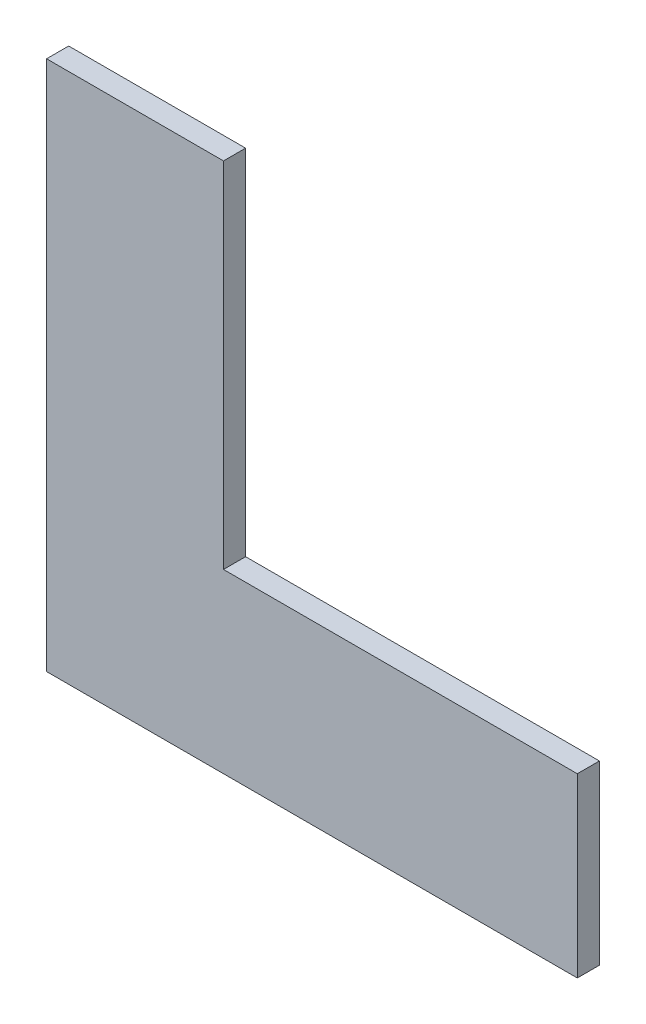
ISO-10303-21;
HEADER;
FILE_DESCRIPTION(('STEP AP214'),'2;1');
FILE_NAME('part.step','',(''),(''),'','','');
FILE_SCHEMA(('AUTOMOTIVE_DESIGN { 1 0 10303 214 1 1 1 1 }'));
ENDSEC;
DATA;
#1=APPLICATION_CONTEXT('core data for automotive mechanical design processes');
#2=APPLICATION_PROTOCOL_DEFINITION('international standard','automotive_design',2000,#1);
#3=PRODUCT_CONTEXT('',#1,'mechanical');
#4=PRODUCT('Part','Part','',(#3));
#5=PRODUCT_RELATED_PRODUCT_CATEGORY('part','',(#4));
#6=PRODUCT_DEFINITION_FORMATION('','',#4);
#7=PRODUCT_DEFINITION_CONTEXT('part definition',#1,'design');
#8=PRODUCT_DEFINITION('design','',#6,#7);
#9=PRODUCT_DEFINITION_SHAPE('','',#8);
#10=(LENGTH_UNIT() NAMED_UNIT(*) SI_UNIT(.MILLI.,.METRE.));
#11=(NAMED_UNIT(*) PLANE_ANGLE_UNIT() SI_UNIT($,.RADIAN.));
#12=(NAMED_UNIT(*) SI_UNIT($,.STERADIAN.) SOLID_ANGLE_UNIT());
#13=UNCERTAINTY_MEASURE_WITH_UNIT(LENGTH_MEASURE(1.E-05),#10,'distance_accuracy_value','');
#14=(GEOMETRIC_REPRESENTATION_CONTEXT(3) GLOBAL_UNCERTAINTY_ASSIGNED_CONTEXT((#13)) GLOBAL_UNIT_ASSIGNED_CONTEXT((#10,
#11,#12)) REPRESENTATION_CONTEXT('',''));
#15=CARTESIAN_POINT('',(0.,0.,0.));
#16=DIRECTION('',(0.,0.,1.));
#17=DIRECTION('',(1.,0.,0.));
#18=AXIS2_PLACEMENT_3D('',#15,#16,#17);
#19=CARTESIAN_POINT('',(-38.1,-38.1,3.175));
#20=DIRECTION('',(1.,0.,0.));
#21=DIRECTION('',(0.,1.,0.));
#22=AXIS2_PLACEMENT_3D('',#19,#20,#21);
#23=PLANE('',#22);
#24=DIRECTION('',(0.,-1.,0.));
#25=VECTOR('',#24,1.);
#26=CARTESIAN_POINT('',(-38.1,-38.1,0.));
#27=LINE('',#26,#25);
#28=CARTESIAN_POINT('',(-38.1,38.1,0.));
#29=VERTEX_POINT('',#28);
#30=CARTESIAN_POINT('',(-38.1,-38.1,0.));
#31=VERTEX_POINT('',#30);
#32=EDGE_CURVE('E121',#29,#31,#27,.T.);
#33=ORIENTED_EDGE('',*,*,#32,.T.);
#34=DIRECTION('',(0.,0.,-1.));
#35=VECTOR('',#34,1.);
#36=CARTESIAN_POINT('',(-38.1,-38.1,3.175));
#37=LINE('',#36,#35);
#38=CARTESIAN_POINT('',(-38.1,-38.1,3.175));
#39=VERTEX_POINT('',#38);
#40=EDGE_CURVE('E11',#39,#31,#37,.T.);
#41=ORIENTED_EDGE('',*,*,#40,.F.);
#42=DIRECTION('',(0.,-1.,0.));
#43=VECTOR('',#42,1.);
#44=CARTESIAN_POINT('',(-38.1,-38.1,3.175));
#45=LINE('',#44,#43);
#46=CARTESIAN_POINT('',(-38.1,38.1,3.175));
#47=VERTEX_POINT('',#46);
#48=EDGE_CURVE('E131',#47,#39,#45,.T.);
#49=ORIENTED_EDGE('',*,*,#48,.F.);
#50=DIRECTION('',(0.,0.,-1.));
#51=VECTOR('',#50,1.);
#52=CARTESIAN_POINT('',(-38.1,38.1,3.175));
#53=LINE('',#52,#51);
#54=EDGE_CURVE('E117',#47,#29,#53,.T.);
#55=ORIENTED_EDGE('',*,*,#54,.T.);
#56=EDGE_LOOP('',(#33,#41,#49,#55));
#57=FACE_BOUND('',#56,.T.);
#58=ADVANCED_FACE('F37',(#57),#23,.F.);
#59=CARTESIAN_POINT('',(38.1,-38.1,3.175));
#60=DIRECTION('',(0.,1.,0.));
#61=DIRECTION('',(-1.,0.,0.));
#62=AXIS2_PLACEMENT_3D('',#59,#60,#61);
#63=PLANE('',#62);
#64=DIRECTION('',(1.,0.,0.));
#65=VECTOR('',#64,1.);
#66=CARTESIAN_POINT('',(38.1,-38.1,0.));
#67=LINE('',#66,#65);
#68=CARTESIAN_POINT('',(38.1,-38.1,0.));
#69=VERTEX_POINT('',#68);
#70=EDGE_CURVE('E124',#31,#69,#67,.T.);
#71=ORIENTED_EDGE('',*,*,#70,.T.);
#72=DIRECTION('',(0.,0.,-1.));
#73=VECTOR('',#72,1.);
#74=CARTESIAN_POINT('',(38.1,-38.1,3.175));
#75=LINE('',#74,#73);
#76=CARTESIAN_POINT('',(38.1,-38.1,3.175));
#77=VERTEX_POINT('',#76);
#78=EDGE_CURVE('E45',#77,#69,#75,.T.);
#79=ORIENTED_EDGE('',*,*,#78,.F.);
#80=DIRECTION('',(1.,0.,0.));
#81=VECTOR('',#80,1.);
#82=CARTESIAN_POINT('',(38.1,-38.1,3.175));
#83=LINE('',#82,#81);
#84=EDGE_CURVE('E90',#39,#77,#83,.T.);
#85=ORIENTED_EDGE('',*,*,#84,.F.);
#86=ORIENTED_EDGE('',*,*,#40,.T.);
#87=EDGE_LOOP('',(#71,#79,#85,#86));
#88=FACE_BOUND('',#87,.T.);
#89=ADVANCED_FACE('F155',(#88),#63,.F.);
#90=CARTESIAN_POINT('',(38.1,-12.7,3.175));
#91=DIRECTION('',(-1.,0.,0.));
#92=DIRECTION('',(0.,-1.,0.));
#93=AXIS2_PLACEMENT_3D('',#90,#91,#92);
#94=PLANE('',#93);
#95=DIRECTION('',(0.,1.,0.));
#96=VECTOR('',#95,1.);
#97=CARTESIAN_POINT('',(38.1,-12.7,0.));
#98=LINE('',#97,#96);
#99=CARTESIAN_POINT('',(38.1,-12.7,0.));
#100=VERTEX_POINT('',#99);
#101=EDGE_CURVE('E126',#69,#100,#98,.T.);
#102=ORIENTED_EDGE('',*,*,#101,.T.);
#103=DIRECTION('',(0.,0.,-1.));
#104=VECTOR('',#103,1.);
#105=CARTESIAN_POINT('',(38.1,-12.7,3.175));
#106=LINE('',#105,#104);
#107=CARTESIAN_POINT('',(38.1,-12.7,3.175));
#108=VERTEX_POINT('',#107);
#109=EDGE_CURVE('E112',#108,#100,#106,.T.);
#110=ORIENTED_EDGE('',*,*,#109,.F.);
#111=DIRECTION('',(0.,1.,0.));
#112=VECTOR('',#111,1.);
#113=CARTESIAN_POINT('',(38.1,-12.7,3.175));
#114=LINE('',#113,#112);
#115=EDGE_CURVE('E103',#77,#108,#114,.T.);
#116=ORIENTED_EDGE('',*,*,#115,.F.);
#117=ORIENTED_EDGE('',*,*,#78,.T.);
#118=EDGE_LOOP('',(#102,#110,#116,#117));
#119=FACE_BOUND('',#118,.T.);
#120=ADVANCED_FACE('F137',(#119),#94,.F.);
#121=CARTESIAN_POINT('',(-12.7,-12.7,3.175));
#122=DIRECTION('',(0.,-1.,0.));
#123=DIRECTION('',(1.,0.,0.));
#124=AXIS2_PLACEMENT_3D('',#121,#122,#123);
#125=PLANE('',#124);
#126=DIRECTION('',(-1.,0.,0.));
#127=VECTOR('',#126,1.);
#128=CARTESIAN_POINT('',(-12.7,-12.7,0.));
#129=LINE('',#128,#127);
#130=CARTESIAN_POINT('',(-12.7,-12.7,0.));
#131=VERTEX_POINT('',#130);
#132=EDGE_CURVE('E111',#100,#131,#129,.T.);
#133=ORIENTED_EDGE('',*,*,#132,.T.);
#134=DIRECTION('',(0.,0.,-1.));
#135=VECTOR('',#134,1.);
#136=CARTESIAN_POINT('',(-12.7,-12.7,3.175));
#137=LINE('',#136,#135);
#138=CARTESIAN_POINT('',(-12.7,-12.7,3.175));
#139=VERTEX_POINT('',#138);
#140=EDGE_CURVE('E108',#139,#131,#137,.T.);
#141=ORIENTED_EDGE('',*,*,#140,.F.);
#142=DIRECTION('',(-1.,0.,0.));
#143=VECTOR('',#142,1.);
#144=CARTESIAN_POINT('',(-12.7,-12.7,3.175));
#145=LINE('',#144,#143);
#146=EDGE_CURVE('E97',#108,#139,#145,.T.);
#147=ORIENTED_EDGE('',*,*,#146,.F.);
#148=ORIENTED_EDGE('',*,*,#109,.T.);
#149=EDGE_LOOP('',(#133,#141,#147,#148));
#150=FACE_BOUND('',#149,.T.);
#151=ADVANCED_FACE('F109',(#150),#125,.F.);
#152=CARTESIAN_POINT('',(-12.7,38.1,3.175));
#153=DIRECTION('',(-1.,0.,0.));
#154=DIRECTION('',(0.,0.,1.));
#155=AXIS2_PLACEMENT_3D('',#152,#153,#154);
#156=PLANE('',#155);
#157=DIRECTION('',(0.,1.,0.));
#158=VECTOR('',#157,1.);
#159=CARTESIAN_POINT('',(-12.7,38.1,0.));
#160=LINE('',#159,#158);
#161=CARTESIAN_POINT('',(-12.7,38.1,0.));
#162=VERTEX_POINT('',#161);
#163=EDGE_CURVE('E76',#131,#162,#160,.T.);
#164=ORIENTED_EDGE('',*,*,#163,.T.);
#165=DIRECTION('',(0.,0.,-1.));
#166=VECTOR('',#165,1.);
#167=CARTESIAN_POINT('',(-12.7,38.1,3.175));
#168=LINE('',#167,#166);
#169=CARTESIAN_POINT('',(-12.7,38.1,3.175));
#170=VERTEX_POINT('',#169);
#171=EDGE_CURVE('E113',#170,#162,#168,.T.);
#172=ORIENTED_EDGE('',*,*,#171,.F.);
#173=DIRECTION('',(0.,1.,0.));
#174=VECTOR('',#173,1.);
#175=CARTESIAN_POINT('',(-12.7,38.1,3.175));
#176=LINE('',#175,#174);
#177=EDGE_CURVE('E101',#139,#170,#176,.T.);
#178=ORIENTED_EDGE('',*,*,#177,.F.);
#179=ORIENTED_EDGE('',*,*,#140,.T.);
#180=EDGE_LOOP('',(#164,#172,#178,#179));
#181=FACE_BOUND('',#180,.T.);
#182=ADVANCED_FACE('F115',(#181),#156,.F.);
#183=CARTESIAN_POINT('',(-38.1,38.1,3.175));
#184=DIRECTION('',(0.,-1.,0.));
#185=DIRECTION('',(0.,0.,-1.));
#186=AXIS2_PLACEMENT_3D('',#183,#184,#185);
#187=PLANE('',#186);
#188=DIRECTION('',(-1.,0.,0.));
#189=VECTOR('',#188,1.);
#190=CARTESIAN_POINT('',(-38.1,38.1,0.));
#191=LINE('',#190,#189);
#192=EDGE_CURVE('E82',#162,#29,#191,.T.);
#193=ORIENTED_EDGE('',*,*,#192,.T.);
#194=ORIENTED_EDGE('',*,*,#54,.F.);
#195=DIRECTION('',(-1.,0.,0.));
#196=VECTOR('',#195,1.);
#197=CARTESIAN_POINT('',(-38.1,38.1,3.175));
#198=LINE('',#197,#196);
#199=EDGE_CURVE('E53',#170,#47,#198,.T.);
#200=ORIENTED_EDGE('',*,*,#199,.F.);
#201=ORIENTED_EDGE('',*,*,#171,.T.);
#202=EDGE_LOOP('',(#193,#194,#200,#201));
#203=FACE_BOUND('',#202,.T.);
#204=ADVANCED_FACE('F144',(#203),#187,.F.);
#205=CARTESIAN_POINT('',(0.,0.,3.175));
#206=DIRECTION('',(0.,0.,-1.));
#207=DIRECTION('',(-1.,0.,0.));
#208=AXIS2_PLACEMENT_3D('',#205,#206,#207);
#209=PLANE('',#208);
#210=ORIENTED_EDGE('',*,*,#48,.T.);
#211=ORIENTED_EDGE('',*,*,#84,.T.);
#212=ORIENTED_EDGE('',*,*,#115,.T.);
#213=ORIENTED_EDGE('',*,*,#146,.T.);
#214=ORIENTED_EDGE('',*,*,#177,.T.);
#215=ORIENTED_EDGE('',*,*,#199,.T.);
#216=EDGE_LOOP('',(#210,#211,#212,#213,#214,#215));
#217=FACE_BOUND('',#216,.T.);
#218=ADVANCED_FACE('F99',(#217),#209,.F.);
#219=CARTESIAN_POINT('',(0.,0.,0.));
#220=DIRECTION('',(0.,0.,-1.));
#221=DIRECTION('',(-1.,0.,0.));
#222=AXIS2_PLACEMENT_3D('',#219,#220,#221);
#223=PLANE('',#222);
#224=ORIENTED_EDGE('',*,*,#32,.F.);
#225=ORIENTED_EDGE('',*,*,#192,.F.);
#226=ORIENTED_EDGE('',*,*,#163,.F.);
#227=ORIENTED_EDGE('',*,*,#132,.F.);
#228=ORIENTED_EDGE('',*,*,#101,.F.);
#229=ORIENTED_EDGE('',*,*,#70,.F.);
#230=EDGE_LOOP('',(#224,#225,#226,#227,#228,#229));
#231=FACE_BOUND('',#230,.T.);
#232=ADVANCED_FACE('F140',(#231),#223,.T.);
#233=CLOSED_SHELL('',(#58,#89,#120,#151,#182,#204,#218,#232));
#234=MANIFOLD_SOLID_BREP('B2',#233);
#235=ADVANCED_BREP_SHAPE_REPRESENTATION('',(#18,#234),#14);
#236=SHAPE_DEFINITION_REPRESENTATION(#9,#235);
ENDSEC;
END-ISO-10303-21;
